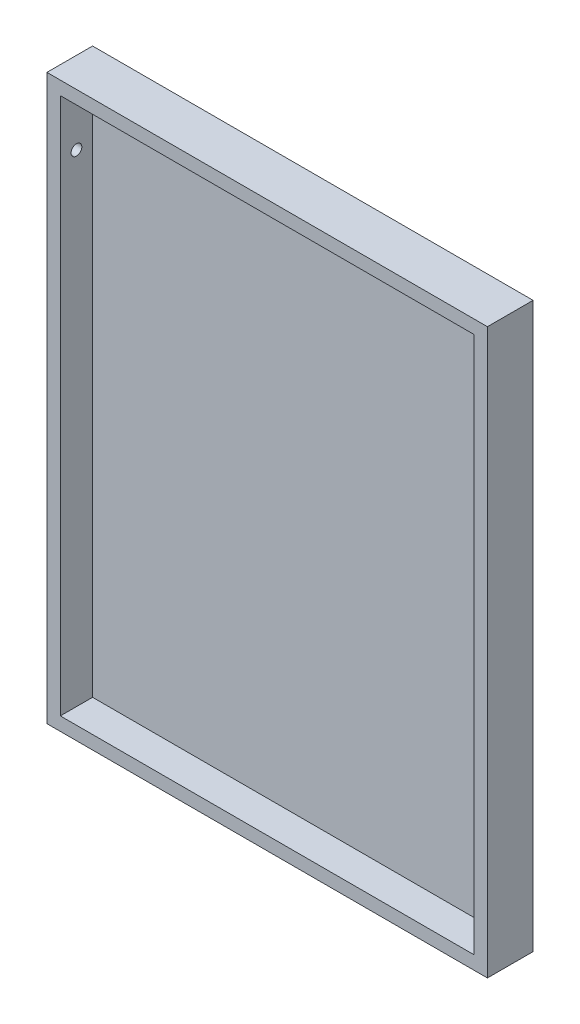
ISO-10303-21;
HEADER;
FILE_DESCRIPTION(('STEP AP214'),'2;1');
FILE_NAME('part.step','',(''),(''),'','','');
FILE_SCHEMA(('AUTOMOTIVE_DESIGN { 1 0 10303 214 1 1 1 1 }'));
ENDSEC;
DATA;
#1=APPLICATION_CONTEXT('core data for automotive mechanical design processes');
#2=APPLICATION_PROTOCOL_DEFINITION('international standard','automotive_design',2000,#1);
#3=PRODUCT_CONTEXT('',#1,'mechanical');
#4=PRODUCT('Part','Part','',(#3));
#5=PRODUCT_RELATED_PRODUCT_CATEGORY('part','',(#4));
#6=PRODUCT_DEFINITION_FORMATION('','',#4);
#7=PRODUCT_DEFINITION_CONTEXT('part definition',#1,'design');
#8=PRODUCT_DEFINITION('design','',#6,#7);
#9=PRODUCT_DEFINITION_SHAPE('','',#8);
#10=(LENGTH_UNIT() NAMED_UNIT(*) SI_UNIT(.MILLI.,.METRE.));
#11=(NAMED_UNIT(*) PLANE_ANGLE_UNIT() SI_UNIT($,.RADIAN.));
#12=(NAMED_UNIT(*) SI_UNIT($,.STERADIAN.) SOLID_ANGLE_UNIT());
#13=UNCERTAINTY_MEASURE_WITH_UNIT(LENGTH_MEASURE(1.E-05),#10,'distance_accuracy_value','');
#14=(GEOMETRIC_REPRESENTATION_CONTEXT(3) GLOBAL_UNCERTAINTY_ASSIGNED_CONTEXT((#13)) GLOBAL_UNIT_ASSIGNED_CONTEXT((#10,
#11,#12)) REPRESENTATION_CONTEXT('',''));
#15=CARTESIAN_POINT('',(0.,0.,0.));
#16=DIRECTION('',(0.,0.,1.));
#17=DIRECTION('',(1.,0.,0.));
#18=AXIS2_PLACEMENT_3D('',#15,#16,#17);
#19=CARTESIAN_POINT('',(-82.,105.,5.));
#20=DIRECTION('',(0.,-1.,0.));
#21=DIRECTION('',(0.,0.,-1.));
#22=AXIS2_PLACEMENT_3D('',#19,#20,#21);
#23=PLANE('',#22);
#24=DIRECTION('',(-1.,0.,0.));
#25=VECTOR('',#24,1.);
#26=CARTESIAN_POINT('',(-82.,105.,0.));
#27=LINE('',#26,#25);
#28=CARTESIAN_POINT('',(82.,105.,0.));
#29=VERTEX_POINT('',#28);
#30=CARTESIAN_POINT('',(-82.,105.,0.));
#31=VERTEX_POINT('',#30);
#32=EDGE_CURVE('E158',#29,#31,#27,.T.);
#33=ORIENTED_EDGE('',*,*,#32,.T.);
#34=DIRECTION('',(0.,0.,-1.));
#35=VECTOR('',#34,1.);
#36=CARTESIAN_POINT('',(-82.,105.,5.));
#37=LINE('',#36,#35);
#38=CARTESIAN_POINT('',(-82.,105.,17.));
#39=VERTEX_POINT('',#38);
#40=EDGE_CURVE('E11',#39,#31,#37,.T.);
#41=ORIENTED_EDGE('',*,*,#40,.F.);
#42=DIRECTION('',(-1.,0.,0.));
#43=VECTOR('',#42,1.);
#44=CARTESIAN_POINT('',(-82.,105.,17.));
#45=LINE('',#44,#43);
#46=CARTESIAN_POINT('',(82.,105.,17.));
#47=VERTEX_POINT('',#46);
#48=EDGE_CURVE('E149',#47,#39,#45,.T.);
#49=ORIENTED_EDGE('',*,*,#48,.F.);
#50=DIRECTION('',(0.,0.,-1.));
#51=VECTOR('',#50,1.);
#52=CARTESIAN_POINT('',(82.,105.,5.));
#53=LINE('',#52,#51);
#54=EDGE_CURVE('E167',#47,#29,#53,.T.);
#55=ORIENTED_EDGE('',*,*,#54,.T.);
#56=EDGE_LOOP('',(#33,#41,#49,#55));
#57=FACE_BOUND('',#56,.T.);
#58=ADVANCED_FACE('F39',(#57),#23,.F.);
#59=CARTESIAN_POINT('',(-82.,-105.,5.));
#60=DIRECTION('',(1.,0.,0.));
#61=DIRECTION('',(0.,0.,-1.));
#62=AXIS2_PLACEMENT_3D('',#59,#60,#61);
#63=PLANE('',#62);
#64=CARTESIAN_POINT('',(-82.,79.5,11.));
#65=DIRECTION('',(1.,0.,0.));
#66=DIRECTION('',(0.,0.,-1.));
#67=AXIS2_PLACEMENT_3D('',#64,#65,#66);
#68=CIRCLE('',#67,2.);
#69=CARTESIAN_POINT('',(-82.,79.5,9.));
#70=VERTEX_POINT('',#69);
#71=EDGE_CURVE('E223',#70,#70,#68,.T.);
#72=ORIENTED_EDGE('',*,*,#71,.T.);
#73=EDGE_LOOP('',(#72));
#74=FACE_BOUND('',#73,.T.);
#75=DIRECTION('',(0.,-1.,0.));
#76=VECTOR('',#75,1.);
#77=CARTESIAN_POINT('',(-82.,-105.,0.));
#78=LINE('',#77,#76);
#79=CARTESIAN_POINT('',(-82.,-105.,0.));
#80=VERTEX_POINT('',#79);
#81=EDGE_CURVE('E161',#31,#80,#78,.T.);
#82=ORIENTED_EDGE('',*,*,#81,.T.);
#83=DIRECTION('',(0.,0.,-1.));
#84=VECTOR('',#83,1.);
#85=CARTESIAN_POINT('',(-82.,-105.,5.));
#86=LINE('',#85,#84);
#87=CARTESIAN_POINT('',(-82.,-105.,17.));
#88=VERTEX_POINT('',#87);
#89=EDGE_CURVE('E50',#88,#80,#86,.T.);
#90=ORIENTED_EDGE('',*,*,#89,.F.);
#91=DIRECTION('',(0.,-1.,0.));
#92=VECTOR('',#91,1.);
#93=CARTESIAN_POINT('',(-82.,105.,17.));
#94=LINE('',#93,#92);
#95=EDGE_CURVE('E155',#39,#88,#94,.T.);
#96=ORIENTED_EDGE('',*,*,#95,.F.);
#97=ORIENTED_EDGE('',*,*,#40,.T.);
#98=EDGE_LOOP('',(#82,#90,#96,#97));
#99=FACE_BOUND('',#98,.T.);
#100=ADVANCED_FACE('F183',(#74,#99),#63,.F.);
#101=CARTESIAN_POINT('',(-82.,-105.,5.));
#102=DIRECTION('',(0.,1.,0.));
#103=DIRECTION('',(0.,0.,1.));
#104=AXIS2_PLACEMENT_3D('',#101,#102,#103);
#105=PLANE('',#104);
#106=DIRECTION('',(1.,0.,0.));
#107=VECTOR('',#106,1.);
#108=CARTESIAN_POINT('',(-82.,-105.,0.));
#109=LINE('',#108,#107);
#110=CARTESIAN_POINT('',(82.,-105.,0.));
#111=VERTEX_POINT('',#110);
#112=EDGE_CURVE('E162',#80,#111,#109,.T.);
#113=ORIENTED_EDGE('',*,*,#112,.T.);
#114=DIRECTION('',(0.,0.,-1.));
#115=VECTOR('',#114,1.);
#116=CARTESIAN_POINT('',(82.,-105.,5.));
#117=LINE('',#116,#115);
#118=CARTESIAN_POINT('',(82.,-105.,17.));
#119=VERTEX_POINT('',#118);
#120=EDGE_CURVE('E169',#119,#111,#117,.T.);
#121=ORIENTED_EDGE('',*,*,#120,.F.);
#122=DIRECTION('',(1.,0.,0.));
#123=VECTOR('',#122,1.);
#124=CARTESIAN_POINT('',(-82.,-105.,17.));
#125=LINE('',#124,#123);
#126=EDGE_CURVE('E154',#88,#119,#125,.T.);
#127=ORIENTED_EDGE('',*,*,#126,.F.);
#128=ORIENTED_EDGE('',*,*,#89,.T.);
#129=EDGE_LOOP('',(#113,#121,#127,#128));
#130=FACE_BOUND('',#129,.T.);
#131=ADVANCED_FACE('F173',(#130),#105,.F.);
#132=CARTESIAN_POINT('',(82.,-105.,5.));
#133=DIRECTION('',(-1.,0.,0.));
#134=DIRECTION('',(0.,0.,1.));
#135=AXIS2_PLACEMENT_3D('',#132,#133,#134);
#136=PLANE('',#135);
#137=DIRECTION('',(0.,1.,0.));
#138=VECTOR('',#137,1.);
#139=CARTESIAN_POINT('',(82.,-105.,0.));
#140=LINE('',#139,#138);
#141=EDGE_CURVE('E61',#111,#29,#140,.T.);
#142=ORIENTED_EDGE('',*,*,#141,.T.);
#143=ORIENTED_EDGE('',*,*,#54,.F.);
#144=DIRECTION('',(0.,1.,0.));
#145=VECTOR('',#144,1.);
#146=CARTESIAN_POINT('',(82.,105.,17.));
#147=LINE('',#146,#145);
#148=EDGE_CURVE('E121',#119,#47,#147,.T.);
#149=ORIENTED_EDGE('',*,*,#148,.F.);
#150=ORIENTED_EDGE('',*,*,#120,.T.);
#151=EDGE_LOOP('',(#142,#143,#149,#150));
#152=FACE_BOUND('',#151,.T.);
#153=ADVANCED_FACE('F181',(#152),#136,.F.);
#154=CARTESIAN_POINT('',(0.,0.,0.));
#155=DIRECTION('',(0.,0.,1.));
#156=DIRECTION('',(1.,0.,0.));
#157=AXIS2_PLACEMENT_3D('',#154,#155,#156);
#158=PLANE('',#157);
#159=ORIENTED_EDGE('',*,*,#32,.F.);
#160=ORIENTED_EDGE('',*,*,#141,.F.);
#161=ORIENTED_EDGE('',*,*,#112,.F.);
#162=ORIENTED_EDGE('',*,*,#81,.F.);
#163=EDGE_LOOP('',(#159,#160,#161,#162));
#164=FACE_BOUND('',#163,.T.);
#165=ADVANCED_FACE('F178',(#164),#158,.F.);
#166=CARTESIAN_POINT('',(0.,0.,17.));
#167=DIRECTION('',(0.,0.,1.));
#168=DIRECTION('',(1.,0.,0.));
#169=AXIS2_PLACEMENT_3D('',#166,#167,#168);
#170=PLANE('',#169);
#171=ORIENTED_EDGE('',*,*,#148,.T.);
#172=ORIENTED_EDGE('',*,*,#48,.T.);
#173=ORIENTED_EDGE('',*,*,#95,.T.);
#174=ORIENTED_EDGE('',*,*,#126,.T.);
#175=EDGE_LOOP('',(#171,#172,#173,#174));
#176=FACE_BOUND('',#175,.T.);
#177=DIRECTION('',(-1.,0.,0.));
#178=VECTOR('',#177,1.);
#179=CARTESIAN_POINT('',(-77.,100.,17.));
#180=LINE('',#179,#178);
#181=CARTESIAN_POINT('',(77.,100.,17.));
#182=VERTEX_POINT('',#181);
#183=CARTESIAN_POINT('',(-77.,100.,17.));
#184=VERTEX_POINT('',#183);
#185=EDGE_CURVE('E111',#182,#184,#180,.T.);
#186=ORIENTED_EDGE('',*,*,#185,.F.);
#187=DIRECTION('',(0.,1.,0.));
#188=VECTOR('',#187,1.);
#189=CARTESIAN_POINT('',(77.,100.,17.));
#190=LINE('',#189,#188);
#191=CARTESIAN_POINT('',(77.,-100.,17.));
#192=VERTEX_POINT('',#191);
#193=EDGE_CURVE('E106',#192,#182,#190,.T.);
#194=ORIENTED_EDGE('',*,*,#193,.F.);
#195=DIRECTION('',(1.,0.,0.));
#196=VECTOR('',#195,1.);
#197=CARTESIAN_POINT('',(-77.,-100.,17.));
#198=LINE('',#197,#196);
#199=CARTESIAN_POINT('',(-77.,-100.,17.));
#200=VERTEX_POINT('',#199);
#201=EDGE_CURVE('E128',#200,#192,#198,.T.);
#202=ORIENTED_EDGE('',*,*,#201,.F.);
#203=DIRECTION('',(0.,-1.,0.));
#204=VECTOR('',#203,1.);
#205=CARTESIAN_POINT('',(-77.,100.,17.));
#206=LINE('',#205,#204);
#207=EDGE_CURVE('E126',#184,#200,#206,.T.);
#208=ORIENTED_EDGE('',*,*,#207,.F.);
#209=EDGE_LOOP('',(#186,#194,#202,#208));
#210=FACE_BOUND('',#209,.T.);
#211=ADVANCED_FACE('F127',(#176,#210),#170,.T.);
#212=CARTESIAN_POINT('',(77.,100.,17.));
#213=DIRECTION('',(-1.,0.,0.));
#214=DIRECTION('',(0.,0.,1.));
#215=AXIS2_PLACEMENT_3D('',#212,#213,#214);
#216=PLANE('',#215);
#217=DIRECTION('',(0.,1.,0.));
#218=VECTOR('',#217,1.);
#219=CARTESIAN_POINT('',(77.,100.,5.));
#220=LINE('',#219,#218);
#221=CARTESIAN_POINT('',(77.,-100.,5.));
#222=VERTEX_POINT('',#221);
#223=CARTESIAN_POINT('',(77.,100.,5.));
#224=VERTEX_POINT('',#223);
#225=EDGE_CURVE('E132',#222,#224,#220,.T.);
#226=ORIENTED_EDGE('',*,*,#225,.F.);
#227=DIRECTION('',(0.,0.,-1.));
#228=VECTOR('',#227,1.);
#229=CARTESIAN_POINT('',(77.,-100.,17.));
#230=LINE('',#229,#228);
#231=EDGE_CURVE('E53',#192,#222,#230,.T.);
#232=ORIENTED_EDGE('',*,*,#231,.F.);
#233=ORIENTED_EDGE('',*,*,#193,.T.);
#234=DIRECTION('',(0.,0.,-1.));
#235=VECTOR('',#234,1.);
#236=CARTESIAN_POINT('',(77.,100.,17.));
#237=LINE('',#236,#235);
#238=EDGE_CURVE('E108',#182,#224,#237,.T.);
#239=ORIENTED_EDGE('',*,*,#238,.T.);
#240=EDGE_LOOP('',(#226,#232,#233,#239));
#241=FACE_BOUND('',#240,.T.);
#242=ADVANCED_FACE('F107',(#241),#216,.T.);
#243=CARTESIAN_POINT('',(-77.,100.,17.));
#244=DIRECTION('',(0.,-1.,0.));
#245=DIRECTION('',(0.,0.,-1.));
#246=AXIS2_PLACEMENT_3D('',#243,#244,#245);
#247=PLANE('',#246);
#248=DIRECTION('',(-1.,0.,0.));
#249=VECTOR('',#248,1.);
#250=CARTESIAN_POINT('',(-77.,100.,5.));
#251=LINE('',#250,#249);
#252=CARTESIAN_POINT('',(-77.,100.,5.));
#253=VERTEX_POINT('',#252);
#254=EDGE_CURVE('E124',#224,#253,#251,.T.);
#255=ORIENTED_EDGE('',*,*,#254,.F.);
#256=ORIENTED_EDGE('',*,*,#238,.F.);
#257=ORIENTED_EDGE('',*,*,#185,.T.);
#258=DIRECTION('',(0.,0.,-1.));
#259=VECTOR('',#258,1.);
#260=CARTESIAN_POINT('',(-77.,100.,17.));
#261=LINE('',#260,#259);
#262=EDGE_CURVE('E125',#184,#253,#261,.T.);
#263=ORIENTED_EDGE('',*,*,#262,.T.);
#264=EDGE_LOOP('',(#255,#256,#257,#263));
#265=FACE_BOUND('',#264,.T.);
#266=ADVANCED_FACE('F120',(#265),#247,.T.);
#267=CARTESIAN_POINT('',(-77.,100.,17.));
#268=DIRECTION('',(1.,0.,0.));
#269=DIRECTION('',(0.,0.,-1.));
#270=AXIS2_PLACEMENT_3D('',#267,#268,#269);
#271=PLANE('',#270);
#272=CARTESIAN_POINT('',(-77.,79.5,11.));
#273=DIRECTION('',(1.,0.,0.));
#274=DIRECTION('',(0.,0.,-1.));
#275=AXIS2_PLACEMENT_3D('',#272,#273,#274);
#276=CIRCLE('',#275,2.);
#277=CARTESIAN_POINT('',(-77.,79.5,9.));
#278=VERTEX_POINT('',#277);
#279=EDGE_CURVE('E45',#278,#278,#276,.F.);
#280=ORIENTED_EDGE('',*,*,#279,.T.);
#281=EDGE_LOOP('',(#280));
#282=FACE_BOUND('',#281,.T.);
#283=DIRECTION('',(0.,-1.,0.));
#284=VECTOR('',#283,1.);
#285=CARTESIAN_POINT('',(-77.,100.,5.));
#286=LINE('',#285,#284);
#287=CARTESIAN_POINT('',(-77.,-100.,5.));
#288=VERTEX_POINT('',#287);
#289=EDGE_CURVE('E140',#253,#288,#286,.T.);
#290=ORIENTED_EDGE('',*,*,#289,.F.);
#291=ORIENTED_EDGE('',*,*,#262,.F.);
#292=ORIENTED_EDGE('',*,*,#207,.T.);
#293=DIRECTION('',(0.,0.,-1.));
#294=VECTOR('',#293,1.);
#295=CARTESIAN_POINT('',(-77.,-100.,17.));
#296=LINE('',#295,#294);
#297=EDGE_CURVE('E145',#200,#288,#296,.T.);
#298=ORIENTED_EDGE('',*,*,#297,.T.);
#299=EDGE_LOOP('',(#290,#291,#292,#298));
#300=FACE_BOUND('',#299,.T.);
#301=ADVANCED_FACE('F211',(#282,#300),#271,.T.);
#302=CARTESIAN_POINT('',(-77.,-100.,17.));
#303=DIRECTION('',(0.,1.,0.));
#304=DIRECTION('',(0.,0.,1.));
#305=AXIS2_PLACEMENT_3D('',#302,#303,#304);
#306=PLANE('',#305);
#307=DIRECTION('',(1.,0.,0.));
#308=VECTOR('',#307,1.);
#309=CARTESIAN_POINT('',(-77.,-100.,5.));
#310=LINE('',#309,#308);
#311=EDGE_CURVE('E113',#288,#222,#310,.T.);
#312=ORIENTED_EDGE('',*,*,#311,.F.);
#313=ORIENTED_EDGE('',*,*,#297,.F.);
#314=ORIENTED_EDGE('',*,*,#201,.T.);
#315=ORIENTED_EDGE('',*,*,#231,.T.);
#316=EDGE_LOOP('',(#312,#313,#314,#315));
#317=FACE_BOUND('',#316,.T.);
#318=ADVANCED_FACE('F204',(#317),#306,.T.);
#319=CARTESIAN_POINT('',(0.,0.,5.));
#320=DIRECTION('',(0.,0.,1.));
#321=DIRECTION('',(1.,0.,0.));
#322=AXIS2_PLACEMENT_3D('',#319,#320,#321);
#323=PLANE('',#322);
#324=ORIENTED_EDGE('',*,*,#311,.T.);
#325=ORIENTED_EDGE('',*,*,#225,.T.);
#326=ORIENTED_EDGE('',*,*,#254,.T.);
#327=ORIENTED_EDGE('',*,*,#289,.T.);
#328=EDGE_LOOP('',(#324,#325,#326,#327));
#329=FACE_BOUND('',#328,.T.);
#330=ADVANCED_FACE('F203',(#329),#323,.T.);
#331=CARTESIAN_POINT('',(-87.6568542494923,79.5,11.));
#332=DIRECTION('',(1.,0.,0.));
#333=DIRECTION('',(0.,0.,-1.));
#334=AXIS2_PLACEMENT_3D('',#331,#332,#333);
#335=CYLINDRICAL_SURFACE('',#334,2.);
#336=CARTESIAN_POINT('',(-77.,79.5,9.));
#337=CARTESIAN_POINT('',(-77.0520833333333,79.5,9.));
#338=CARTESIAN_POINT('',(-77.1041666666666,79.5,9.));
#339=CARTESIAN_POINT('',(-77.2083333333333,79.5,9.));
#340=CARTESIAN_POINT('',(-77.2604166666667,79.5,9.));
#341=CARTESIAN_POINT('',(-77.3645833333333,79.5,9.));
#342=CARTESIAN_POINT('',(-77.4166666666666,79.5,9.));
#343=CARTESIAN_POINT('',(-77.5208333333333,79.5,9.));
#344=CARTESIAN_POINT('',(-77.5729166666666,79.5,9.));
#345=CARTESIAN_POINT('',(-77.6770833333333,79.5,9.));
#346=CARTESIAN_POINT('',(-77.7291666666666,79.5,9.));
#347=CARTESIAN_POINT('',(-77.8333333333333,79.5,9.));
#348=CARTESIAN_POINT('',(-77.8854166666667,79.5,9.));
#349=CARTESIAN_POINT('',(-77.9895833333333,79.5,9.));
#350=CARTESIAN_POINT('',(-78.0416666666666,79.5,9.));
#351=CARTESIAN_POINT('',(-78.1458333333333,79.5,9.));
#352=CARTESIAN_POINT('',(-78.1979166666666,79.5,9.));
#353=CARTESIAN_POINT('',(-78.3020833333333,79.5,9.));
#354=CARTESIAN_POINT('',(-78.3541666666666,79.5,9.));
#355=CARTESIAN_POINT('',(-78.4583333333333,79.5,9.));
#356=CARTESIAN_POINT('',(-78.5104166666667,79.5,9.));
#357=CARTESIAN_POINT('',(-78.6145833333333,79.5,9.));
#358=CARTESIAN_POINT('',(-78.6666666666666,79.5,9.));
#359=CARTESIAN_POINT('',(-78.7708333333333,79.5,9.));
#360=CARTESIAN_POINT('',(-78.8229166666666,79.5,9.));
#361=CARTESIAN_POINT('',(-78.9270833333333,79.5,9.));
#362=CARTESIAN_POINT('',(-78.9791666666666,79.5,9.));
#363=CARTESIAN_POINT('',(-79.0833333333333,79.5,9.));
#364=CARTESIAN_POINT('',(-79.1354166666667,79.5,9.));
#365=CARTESIAN_POINT('',(-79.2395833333333,79.5,9.));
#366=CARTESIAN_POINT('',(-79.2916666666666,79.5,9.));
#367=CARTESIAN_POINT('',(-79.3958333333333,79.5,9.));
#368=CARTESIAN_POINT('',(-79.4479166666666,79.5,9.));
#369=CARTESIAN_POINT('',(-79.5520833333333,79.5,9.));
#370=CARTESIAN_POINT('',(-79.6041666666666,79.5,9.));
#371=CARTESIAN_POINT('',(-79.7083333333333,79.5,9.));
#372=CARTESIAN_POINT('',(-79.7604166666667,79.5,9.));
#373=CARTESIAN_POINT('',(-79.8645833333333,79.5,9.));
#374=CARTESIAN_POINT('',(-79.9166666666666,79.5,9.));
#375=CARTESIAN_POINT('',(-80.0208333333333,79.5,9.));
#376=CARTESIAN_POINT('',(-80.0729166666666,79.5,9.));
#377=CARTESIAN_POINT('',(-80.1770833333333,79.5,9.));
#378=CARTESIAN_POINT('',(-80.2291666666666,79.5,9.));
#379=CARTESIAN_POINT('',(-80.3333333333333,79.5,9.));
#380=CARTESIAN_POINT('',(-80.3854166666667,79.5,9.));
#381=CARTESIAN_POINT('',(-80.4895833333333,79.5,9.));
#382=CARTESIAN_POINT('',(-80.5416666666667,79.5,9.));
#383=CARTESIAN_POINT('',(-80.6458333333333,79.5,9.));
#384=CARTESIAN_POINT('',(-80.6979166666666,79.5,9.));
#385=CARTESIAN_POINT('',(-80.8020833333333,79.5,9.));
#386=CARTESIAN_POINT('',(-80.8541666666666,79.5,9.));
#387=CARTESIAN_POINT('',(-80.9583333333333,79.5,9.));
#388=CARTESIAN_POINT('',(-81.0104166666667,79.5,9.));
#389=CARTESIAN_POINT('',(-81.1145833333333,79.5,9.));
#390=CARTESIAN_POINT('',(-81.1666666666667,79.5,9.));
#391=CARTESIAN_POINT('',(-81.2708333333333,79.5,9.));
#392=CARTESIAN_POINT('',(-81.3229166666666,79.5,9.));
#393=CARTESIAN_POINT('',(-81.4270833333333,79.5,9.));
#394=CARTESIAN_POINT('',(-81.4791666666666,79.5,9.));
#395=CARTESIAN_POINT('',(-81.5833333333333,79.5,9.));
#396=CARTESIAN_POINT('',(-81.6354166666667,79.5,9.));
#397=CARTESIAN_POINT('',(-81.7395833333333,79.5,9.));
#398=CARTESIAN_POINT('',(-81.7916666666667,79.5,9.));
#399=CARTESIAN_POINT('',(-81.8958333333333,79.5,9.));
#400=CARTESIAN_POINT('',(-81.9479166666666,79.5,9.));
#401=CARTESIAN_POINT('',(-82.,79.5,9.));
#402=B_SPLINE_CURVE_WITH_KNOTS('',3,(#336,#337,#338,#339,#340,#341,#342,#343,#344,#345,#346,
#347,#348,#349,#350,#351,#352,#353,#354,#355,#356,#357,#358,#359,#360,#361,#362,#363,#364,#365,
#366,#367,#368,#369,#370,#371,#372,#373,#374,#375,#376,#377,#378,#379,#380,#381,#382,#383,#384,
#385,#386,#387,#388,#389,#390,#391,#392,#393,#394,#395,#396,#397,#398,#399,#400,#401),
.UNSPECIFIED.,.F.,.F.,(4,2,2,2,2,2,2,2,2,2,2,2,2,2,2,2,2,2,2,2,2,2,2,2,2,2,2,2,2,2,2,2,4),(0.,
0.156250000000011,0.312500000000007,0.468750000000004,0.625000000000001,0.781250000000011,
0.937500000000008,1.09375,1.25,1.40625000000001,1.56250000000001,1.71875,1.875,2.03125000000001,
2.18750000000001,2.34375000000001,2.5,2.65625000000001,2.81250000000001,2.96875000000001,3.125,
3.28125000000001,3.43750000000001,3.59375000000001,3.75,3.90625000000001,4.06250000000001,
4.21875000000001,4.375,4.53125000000001,4.68750000000001,4.84375000000001,5.),.UNSPECIFIED.);
#403=EDGE_CURVE('BSEAM201',#278,#70,#402,.T.);
#404=ORIENTED_EDGE('',*,*,#279,.F.);
#405=ORIENTED_EDGE('',*,*,#71,.F.);
#406=ORIENTED_EDGE('',*,*,#403,.T.);
#407=ORIENTED_EDGE('',*,*,#403,.F.);
#408=EDGE_LOOP('',(#404,#406,#405,#407));
#409=FACE_BOUND('',#408,.T.);
#410=ADVANCED_FACE('F201',(#409),#335,.F.);
#411=CLOSED_SHELL('',(#58,#100,#131,#153,#165,#211,#242,#266,#301,#318,#330,#410));
#412=MANIFOLD_SOLID_BREP('B2',#411);
#413=ADVANCED_BREP_SHAPE_REPRESENTATION('',(#18,#412),#14);
#414=SHAPE_DEFINITION_REPRESENTATION(#9,#413);
ENDSEC;
END-ISO-10303-21;
